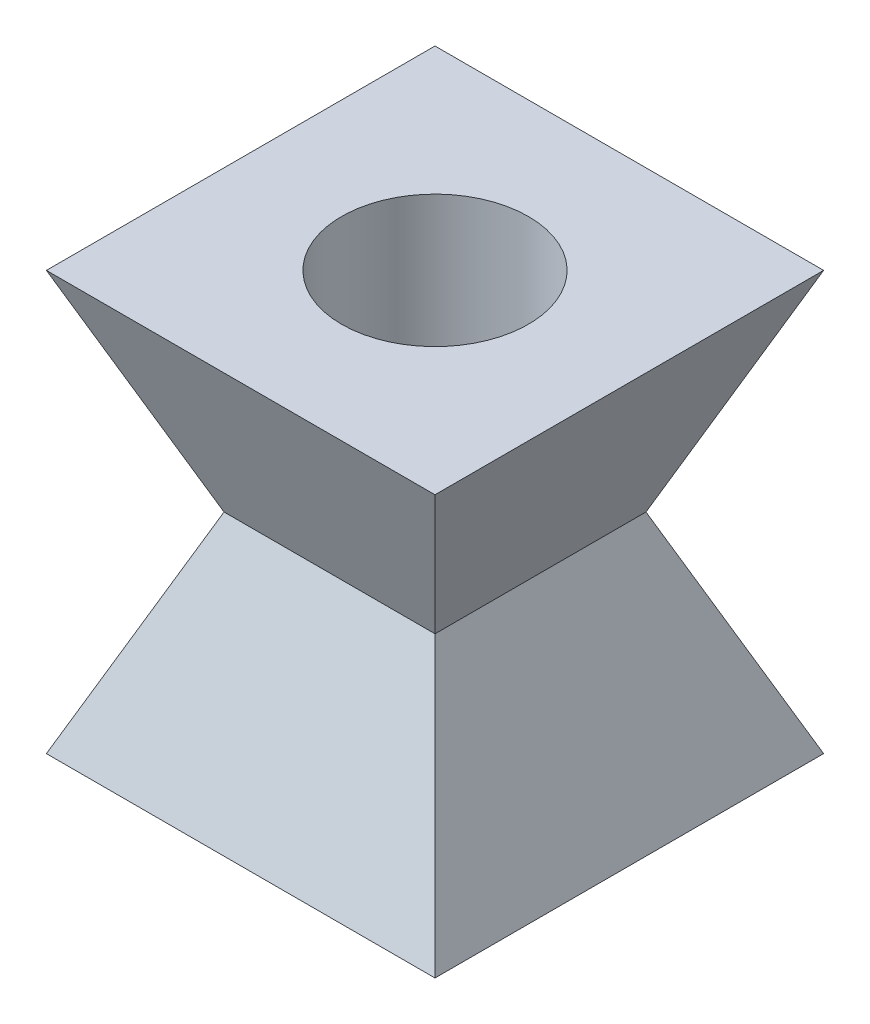
ISO-10303-21;
HEADER;
FILE_DESCRIPTION(('STEP AP214'),'2;1');
FILE_NAME('part.step','',(''),(''),'','','');
FILE_SCHEMA(('AUTOMOTIVE_DESIGN { 1 0 10303 214 1 1 1 1 }'));
ENDSEC;
DATA;
#1=APPLICATION_CONTEXT('core data for automotive mechanical design processes');
#2=APPLICATION_PROTOCOL_DEFINITION('international standard','automotive_design',2000,#1);
#3=PRODUCT_CONTEXT('',#1,'mechanical');
#4=PRODUCT('Part','Part','',(#3));
#5=PRODUCT_RELATED_PRODUCT_CATEGORY('part','',(#4));
#6=PRODUCT_DEFINITION_FORMATION('','',#4);
#7=PRODUCT_DEFINITION_CONTEXT('part definition',#1,'design');
#8=PRODUCT_DEFINITION('design','',#6,#7);
#9=PRODUCT_DEFINITION_SHAPE('','',#8);
#10=(LENGTH_UNIT() NAMED_UNIT(*) SI_UNIT(.MILLI.,.METRE.));
#11=(NAMED_UNIT(*) PLANE_ANGLE_UNIT() SI_UNIT($,.RADIAN.));
#12=(NAMED_UNIT(*) SI_UNIT($,.STERADIAN.) SOLID_ANGLE_UNIT());
#13=UNCERTAINTY_MEASURE_WITH_UNIT(LENGTH_MEASURE(1.E-05),#10,'distance_accuracy_value','');
#14=(GEOMETRIC_REPRESENTATION_CONTEXT(3) GLOBAL_UNCERTAINTY_ASSIGNED_CONTEXT((#13)) GLOBAL_UNIT_ASSIGNED_CONTEXT((#10,
#11,#12)) REPRESENTATION_CONTEXT('',''));
#15=CARTESIAN_POINT('',(0.,0.,0.));
#16=DIRECTION('',(0.,0.,1.));
#17=DIRECTION('',(1.,0.,0.));
#18=AXIS2_PLACEMENT_3D('',#15,#16,#17);
#19=CARTESIAN_POINT('',(23.9196032224521,10.1532691816569,52.));
#20=DIRECTION('',(0.920504853452442,0.390731128489268,0.));
#21=DIRECTION('',(-0.390731128489269,0.920504853452443,0.));
#22=AXIS2_PLACEMENT_3D('',#19,#20,#21);
#23=PLANE('',#22);
#24=DIRECTION('',(0.,0.,-1.));
#25=VECTOR('',#24,1.);
#26=CARTESIAN_POINT('',(28.2294102922625,0.,52.));
#27=LINE('',#26,#25);
#28=CARTESIAN_POINT('',(28.2294102922625,0.,28.2294102922621));
#29=VERTEX_POINT('',#28);
#30=CARTESIAN_POINT('',(28.2294102922625,0.,-28.2294102922621));
#31=VERTEX_POINT('',#30);
#32=EDGE_CURVE('E11',#29,#31,#27,.T.);
#33=ORIENTED_EDGE('',*,*,#32,.F.);
#34=DIRECTION('',(0.363936289648097,-0.857380168976603,0.363936289648104));
#35=VECTOR('',#34,1.);
#36=CARTESIAN_POINT('',(27.6388411871618,1.39129362343403,27.6388411871613));
#37=LINE('',#36,#35);
#38=CARTESIAN_POINT('',(52.,-56.,52.));
#39=VERTEX_POINT('',#38);
#40=EDGE_CURVE('E96',#29,#39,#37,.T.);
#41=ORIENTED_EDGE('',*,*,#40,.T.);
#42=DIRECTION('',(0.,0.,-1.));
#43=VECTOR('',#42,1.);
#44=CARTESIAN_POINT('',(52.,-56.,52.));
#45=LINE('',#44,#43);
#46=CARTESIAN_POINT('',(52.,-56.,-52.));
#47=VERTEX_POINT('',#46);
#48=EDGE_CURVE('E102',#39,#47,#45,.T.);
#49=ORIENTED_EDGE('',*,*,#48,.T.);
#50=DIRECTION('',(0.363936289648097,-0.857380168976602,-0.363936289648104));
#51=VECTOR('',#50,1.);
#52=CARTESIAN_POINT('',(13.8640804031878,33.8425964050158,-13.8640804031871));
#53=LINE('',#52,#51);
#54=EDGE_CURVE('E155',#31,#47,#53,.T.);
#55=ORIENTED_EDGE('',*,*,#54,.F.);
#56=EDGE_LOOP('',(#33,#41,#49,#55));
#57=FACE_BOUND('',#56,.T.);
#58=ADVANCED_FACE('F45',(#57),#23,.T.);
#59=CARTESIAN_POINT('',(23.9196032224521,-10.1532691816569,52.));
#60=DIRECTION('',(-0.920504853452442,0.390731128489268,0.));
#61=DIRECTION('',(-0.390731128489269,-0.920504853452443,0.));
#62=AXIS2_PLACEMENT_3D('',#59,#60,#61);
#63=PLANE('',#62);
#64=DIRECTION('',(0.363936289648097,0.857380168976603,0.363936289648104));
#65=VECTOR('',#64,1.);
#66=CARTESIAN_POINT('',(27.6388411871618,-1.39129362343403,27.6388411871613));
#67=LINE('',#66,#65);
#68=CARTESIAN_POINT('',(52.,56.,52.));
#69=VERTEX_POINT('',#68);
#70=EDGE_CURVE('E143',#29,#69,#67,.T.);
#71=ORIENTED_EDGE('',*,*,#70,.F.);
#72=ORIENTED_EDGE('',*,*,#32,.T.);
#73=DIRECTION('',(0.363936289648097,0.857380168976602,-0.363936289648104));
#74=VECTOR('',#73,1.);
#75=CARTESIAN_POINT('',(13.8640804031878,-33.8425964050158,-13.8640804031871));
#76=LINE('',#75,#74);
#77=CARTESIAN_POINT('',(52.,56.,-52.));
#78=VERTEX_POINT('',#77);
#79=EDGE_CURVE('E144',#31,#78,#76,.T.);
#80=ORIENTED_EDGE('',*,*,#79,.T.);
#81=DIRECTION('',(0.,0.,-1.));
#82=VECTOR('',#81,1.);
#83=CARTESIAN_POINT('',(52.,56.,52.));
#84=LINE('',#83,#82);
#85=EDGE_CURVE('E54',#69,#78,#84,.T.);
#86=ORIENTED_EDGE('',*,*,#85,.F.);
#87=EDGE_LOOP('',(#71,#72,#80,#86));
#88=FACE_BOUND('',#87,.T.);
#89=ADVANCED_FACE('F142',(#88),#63,.F.);
#90=CARTESIAN_POINT('',(-23.9196032224521,-10.1532691816569,52.));
#91=DIRECTION('',(-0.920504853452442,-0.390731128489268,0.));
#92=DIRECTION('',(0.390731128489269,-0.920504853452443,0.));
#93=AXIS2_PLACEMENT_3D('',#90,#91,#92);
#94=PLANE('',#93);
#95=DIRECTION('',(0.,0.,-1.));
#96=VECTOR('',#95,1.);
#97=CARTESIAN_POINT('',(-28.2294102922625,0.,52.));
#98=LINE('',#97,#96);
#99=CARTESIAN_POINT('',(-28.2294102922625,0.,28.2294102922621));
#100=VERTEX_POINT('',#99);
#101=CARTESIAN_POINT('',(-28.2294102922625,0.,-28.229410292262));
#102=VERTEX_POINT('',#101);
#103=EDGE_CURVE('E119',#100,#102,#98,.T.);
#104=ORIENTED_EDGE('',*,*,#103,.F.);
#105=DIRECTION('',(-0.363936289648097,0.857380168976603,0.363936289648104));
#106=VECTOR('',#105,1.);
#107=CARTESIAN_POINT('',(-27.6388411871618,-1.39129362343403,27.6388411871613));
#108=LINE('',#107,#106);
#109=CARTESIAN_POINT('',(-52.,56.,52.));
#110=VERTEX_POINT('',#109);
#111=EDGE_CURVE('E111',#100,#110,#108,.T.);
#112=ORIENTED_EDGE('',*,*,#111,.T.);
#113=DIRECTION('',(0.,0.,-1.));
#114=VECTOR('',#113,1.);
#115=CARTESIAN_POINT('',(-52.,56.,52.));
#116=LINE('',#115,#114);
#117=CARTESIAN_POINT('',(-52.,56.,-52.));
#118=VERTEX_POINT('',#117);
#119=EDGE_CURVE('E127',#110,#118,#116,.T.);
#120=ORIENTED_EDGE('',*,*,#119,.T.);
#121=DIRECTION('',(-0.363936289648097,0.857380168976602,-0.363936289648104));
#122=VECTOR('',#121,1.);
#123=CARTESIAN_POINT('',(-13.8640804031878,-33.8425964050158,-13.8640804031871));
#124=LINE('',#123,#122);
#125=EDGE_CURVE('E150',#102,#118,#124,.T.);
#126=ORIENTED_EDGE('',*,*,#125,.F.);
#127=EDGE_LOOP('',(#104,#112,#120,#126));
#128=FACE_BOUND('',#127,.T.);
#129=ADVANCED_FACE('F188',(#128),#94,.T.);
#130=CARTESIAN_POINT('',(-23.9196032224521,10.1532691816569,52.));
#131=DIRECTION('',(0.920504853452442,-0.390731128489268,0.));
#132=DIRECTION('',(0.390731128489269,0.920504853452443,0.));
#133=AXIS2_PLACEMENT_3D('',#130,#131,#132);
#134=PLANE('',#133);
#135=DIRECTION('',(-0.363936289648097,-0.857380168976603,0.363936289648104));
#136=VECTOR('',#135,1.);
#137=CARTESIAN_POINT('',(-27.6388411871618,1.39129362343403,27.6388411871613));
#138=LINE('',#137,#136);
#139=CARTESIAN_POINT('',(-52.,-56.,52.));
#140=VERTEX_POINT('',#139);
#141=EDGE_CURVE('E60',#100,#140,#138,.T.);
#142=ORIENTED_EDGE('',*,*,#141,.F.);
#143=ORIENTED_EDGE('',*,*,#103,.T.);
#144=DIRECTION('',(-0.363936289648097,-0.857380168976602,-0.363936289648104));
#145=VECTOR('',#144,1.);
#146=CARTESIAN_POINT('',(-13.8640804031878,33.8425964050158,-13.8640804031871));
#147=LINE('',#146,#145);
#148=CARTESIAN_POINT('',(-52.,-56.,-52.));
#149=VERTEX_POINT('',#148);
#150=EDGE_CURVE('E149',#102,#149,#147,.T.);
#151=ORIENTED_EDGE('',*,*,#150,.T.);
#152=DIRECTION('',(0.,0.,-1.));
#153=VECTOR('',#152,1.);
#154=CARTESIAN_POINT('',(-52.,-56.,52.));
#155=LINE('',#154,#153);
#156=EDGE_CURVE('E116',#140,#149,#155,.T.);
#157=ORIENTED_EDGE('',*,*,#156,.F.);
#158=EDGE_LOOP('',(#142,#143,#151,#157));
#159=FACE_BOUND('',#158,.T.);
#160=ADVANCED_FACE('F184',(#159),#134,.F.);
#161=CARTESIAN_POINT('',(0.,56.,52.));
#162=DIRECTION('',(0.,-1.,0.));
#163=DIRECTION('',(0.,0.,-1.));
#164=AXIS2_PLACEMENT_3D('',#161,#162,#163);
#165=PLANE('',#164);
#166=CARTESIAN_POINT('',(0.,56.,0.));
#167=DIRECTION('',(0.,1.,0.));
#168=DIRECTION('',(0.,0.,1.));
#169=AXIS2_PLACEMENT_3D('',#166,#167,#168);
#170=CIRCLE('',#169,25.);
#171=CARTESIAN_POINT('',(0.,56.,25.));
#172=VERTEX_POINT('',#171);
#173=EDGE_CURVE('E170',#172,#172,#170,.T.);
#174=ORIENTED_EDGE('',*,*,#173,.F.);
#175=EDGE_LOOP('',(#174));
#176=FACE_BOUND('',#175,.T.);
#177=DIRECTION('',(-1.,0.,0.));
#178=VECTOR('',#177,1.);
#179=CARTESIAN_POINT('',(0.,56.,-52.));
#180=LINE('',#179,#178);
#181=EDGE_CURVE('E138',#78,#118,#180,.T.);
#182=ORIENTED_EDGE('',*,*,#181,.T.);
#183=ORIENTED_EDGE('',*,*,#119,.F.);
#184=DIRECTION('',(-1.,0.,0.));
#185=VECTOR('',#184,1.);
#186=CARTESIAN_POINT('',(0.,56.,52.));
#187=LINE('',#186,#185);
#188=EDGE_CURVE('E103',#69,#110,#187,.T.);
#189=ORIENTED_EDGE('',*,*,#188,.F.);
#190=ORIENTED_EDGE('',*,*,#85,.T.);
#191=EDGE_LOOP('',(#182,#183,#189,#190));
#192=FACE_BOUND('',#191,.T.);
#193=ADVANCED_FACE('F136',(#176,#192),#165,.F.);
#194=CARTESIAN_POINT('',(0.,-56.,52.));
#195=DIRECTION('',(0.,-1.,0.));
#196=DIRECTION('',(0.,0.,-1.));
#197=AXIS2_PLACEMENT_3D('',#194,#195,#196);
#198=PLANE('',#197);
#199=CARTESIAN_POINT('',(0.,-56.,0.));
#200=DIRECTION('',(0.,1.,0.));
#201=DIRECTION('',(0.,0.,1.));
#202=AXIS2_PLACEMENT_3D('',#199,#200,#201);
#203=CIRCLE('',#202,25.);
#204=CARTESIAN_POINT('',(0.,-56.,25.));
#205=VERTEX_POINT('',#204);
#206=EDGE_CURVE('E171',#205,#205,#203,.T.);
#207=ORIENTED_EDGE('',*,*,#206,.T.);
#208=EDGE_LOOP('',(#207));
#209=FACE_BOUND('',#208,.T.);
#210=DIRECTION('',(-1.,0.,0.));
#211=VECTOR('',#210,1.);
#212=CARTESIAN_POINT('',(0.,-56.,-52.));
#213=LINE('',#212,#211);
#214=EDGE_CURVE('E114',#47,#149,#213,.T.);
#215=ORIENTED_EDGE('',*,*,#214,.F.);
#216=ORIENTED_EDGE('',*,*,#48,.F.);
#217=DIRECTION('',(-1.,0.,0.));
#218=VECTOR('',#217,1.);
#219=CARTESIAN_POINT('',(0.,-56.,52.));
#220=LINE('',#219,#218);
#221=EDGE_CURVE('E93',#39,#140,#220,.T.);
#222=ORIENTED_EDGE('',*,*,#221,.T.);
#223=ORIENTED_EDGE('',*,*,#156,.T.);
#224=EDGE_LOOP('',(#215,#216,#222,#223));
#225=FACE_BOUND('',#224,.T.);
#226=ADVANCED_FACE('F113',(#209,#225),#198,.T.);
#227=CARTESIAN_POINT('',(0.,-56.,0.));
#228=DIRECTION('',(0.,1.,0.));
#229=DIRECTION('',(0.,0.,1.));
#230=AXIS2_PLACEMENT_3D('',#227,#228,#229);
#231=CYLINDRICAL_SURFACE('',#230,25.);
#232=CARTESIAN_POINT('',(0.,-56.,25.));
#233=CARTESIAN_POINT('',(0.,-54.8333333333333,25.));
#234=CARTESIAN_POINT('',(0.,-53.6666666666667,25.));
#235=CARTESIAN_POINT('',(0.,-51.3333333333333,25.));
#236=CARTESIAN_POINT('',(0.,-50.1666666666667,25.));
#237=CARTESIAN_POINT('',(0.,-47.8333333333333,25.));
#238=CARTESIAN_POINT('',(0.,-46.6666666666667,25.));
#239=CARTESIAN_POINT('',(0.,-44.3333333333333,25.));
#240=CARTESIAN_POINT('',(0.,-43.1666666666667,25.));
#241=CARTESIAN_POINT('',(0.,-40.8333333333333,25.));
#242=CARTESIAN_POINT('',(0.,-39.6666666666667,25.));
#243=CARTESIAN_POINT('',(0.,-37.3333333333333,25.));
#244=CARTESIAN_POINT('',(0.,-36.1666666666667,25.));
#245=CARTESIAN_POINT('',(0.,-33.8333333333333,25.));
#246=CARTESIAN_POINT('',(0.,-32.6666666666667,25.));
#247=CARTESIAN_POINT('',(0.,-30.3333333333333,25.));
#248=CARTESIAN_POINT('',(0.,-29.1666666666667,25.));
#249=CARTESIAN_POINT('',(0.,-26.8333333333333,25.));
#250=CARTESIAN_POINT('',(0.,-25.6666666666667,25.));
#251=CARTESIAN_POINT('',(0.,-23.3333333333333,25.));
#252=CARTESIAN_POINT('',(0.,-22.1666666666667,25.));
#253=CARTESIAN_POINT('',(0.,-19.8333333333333,25.));
#254=CARTESIAN_POINT('',(0.,-18.6666666666667,25.));
#255=CARTESIAN_POINT('',(0.,-16.3333333333333,25.));
#256=CARTESIAN_POINT('',(0.,-15.1666666666667,25.));
#257=CARTESIAN_POINT('',(0.,-12.8333333333333,25.));
#258=CARTESIAN_POINT('',(0.,-11.6666666666667,25.));
#259=CARTESIAN_POINT('',(0.,-9.33333333333334,25.));
#260=CARTESIAN_POINT('',(0.,-8.16666666666667,25.));
#261=CARTESIAN_POINT('',(0.,-5.83333333333334,25.));
#262=CARTESIAN_POINT('',(0.,-4.66666666666668,25.));
#263=CARTESIAN_POINT('',(0.,-2.33333333333334,25.));
#264=CARTESIAN_POINT('',(0.,-1.16666666666667,25.));
#265=CARTESIAN_POINT('',(0.,1.16666666666666,25.));
#266=CARTESIAN_POINT('',(0.,2.33333333333333,25.));
#267=CARTESIAN_POINT('',(0.,4.66666666666666,25.));
#268=CARTESIAN_POINT('',(0.,5.83333333333333,25.));
#269=CARTESIAN_POINT('',(0.,8.16666666666666,25.));
#270=CARTESIAN_POINT('',(0.,9.33333333333332,25.));
#271=CARTESIAN_POINT('',(0.,11.6666666666666,25.));
#272=CARTESIAN_POINT('',(0.,12.8333333333333,25.));
#273=CARTESIAN_POINT('',(0.,15.1666666666667,25.));
#274=CARTESIAN_POINT('',(0.,16.3333333333333,25.));
#275=CARTESIAN_POINT('',(0.,18.6666666666667,25.));
#276=CARTESIAN_POINT('',(0.,19.8333333333333,25.));
#277=CARTESIAN_POINT('',(0.,22.1666666666666,25.));
#278=CARTESIAN_POINT('',(0.,23.3333333333333,25.));
#279=CARTESIAN_POINT('',(0.,25.6666666666666,25.));
#280=CARTESIAN_POINT('',(0.,26.8333333333333,25.));
#281=CARTESIAN_POINT('',(0.,29.1666666666667,25.));
#282=CARTESIAN_POINT('',(0.,30.3333333333333,25.));
#283=CARTESIAN_POINT('',(0.,32.6666666666667,25.));
#284=CARTESIAN_POINT('',(0.,33.8333333333333,25.));
#285=CARTESIAN_POINT('',(0.,36.1666666666667,25.));
#286=CARTESIAN_POINT('',(0.,37.3333333333333,25.));
#287=CARTESIAN_POINT('',(0.,39.6666666666667,25.));
#288=CARTESIAN_POINT('',(0.,40.8333333333333,25.));
#289=CARTESIAN_POINT('',(0.,43.1666666666667,25.));
#290=CARTESIAN_POINT('',(0.,44.3333333333333,25.));
#291=CARTESIAN_POINT('',(0.,46.6666666666667,25.));
#292=CARTESIAN_POINT('',(0.,47.8333333333333,25.));
#293=CARTESIAN_POINT('',(0.,50.1666666666666,25.));
#294=CARTESIAN_POINT('',(0.,51.3333333333333,25.));
#295=CARTESIAN_POINT('',(0.,53.6666666666667,25.));
#296=CARTESIAN_POINT('',(0.,54.8333333333333,25.));
#297=CARTESIAN_POINT('',(0.,56.,25.));
#298=B_SPLINE_CURVE_WITH_KNOTS('',3,(#232,#233,#234,#235,#236,#237,#238,#239,#240,#241,#242,
#243,#244,#245,#246,#247,#248,#249,#250,#251,#252,#253,#254,#255,#256,#257,#258,#259,#260,#261,
#262,#263,#264,#265,#266,#267,#268,#269,#270,#271,#272,#273,#274,#275,#276,#277,#278,#279,#280,
#281,#282,#283,#284,#285,#286,#287,#288,#289,#290,#291,#292,#293,#294,#295,#296,#297),
.UNSPECIFIED.,.F.,.F.,(4,2,2,2,2,2,2,2,2,2,2,2,2,2,2,2,2,2,2,2,2,2,2,2,2,2,2,2,2,2,2,2,4),(0.,
3.5,6.99999999999999,10.5,14.,17.5,21.,24.5,28.,31.5,35.,38.5,42.,45.5,49.,52.5,56.,59.5,63.,
66.5,70.,73.5,77.,80.5,84.,87.5,91.,94.5,98.,101.5,105.,108.5,112.),.UNSPECIFIED.);
#299=EDGE_CURVE('BSEAM220',#205,#172,#298,.T.);
#300=ORIENTED_EDGE('',*,*,#206,.F.);
#301=ORIENTED_EDGE('',*,*,#173,.T.);
#302=ORIENTED_EDGE('',*,*,#299,.T.);
#303=ORIENTED_EDGE('',*,*,#299,.F.);
#304=EDGE_LOOP('',(#300,#302,#301,#303));
#305=FACE_BOUND('',#304,.T.);
#306=ADVANCED_FACE('F220',(#305),#231,.F.);
#307=CARTESIAN_POINT('',(-52.,0.,-28.2294102922621));
#308=DIRECTION('',(0.,-0.390731128489275,0.92050485345244));
#309=DIRECTION('',(0.,-0.92050485345244,-0.390731128489275));
#310=AXIS2_PLACEMENT_3D('',#307,#308,#309);
#311=PLANE('',#310);
#312=ORIENTED_EDGE('',*,*,#54,.T.);
#313=ORIENTED_EDGE('',*,*,#214,.T.);
#314=ORIENTED_EDGE('',*,*,#150,.F.);
#315=DIRECTION('',(1.,0.,0.));
#316=VECTOR('',#315,1.);
#317=CARTESIAN_POINT('',(-52.,0.,-28.2294102922621));
#318=LINE('',#317,#316);
#319=EDGE_CURVE('E190',#102,#31,#318,.T.);
#320=ORIENTED_EDGE('',*,*,#319,.T.);
#321=EDGE_LOOP('',(#312,#313,#314,#320));
#322=FACE_BOUND('',#321,.T.);
#323=ADVANCED_FACE('F182',(#322),#311,.F.);
#324=CARTESIAN_POINT('',(-52.,56.,-52.));
#325=DIRECTION('',(0.,0.390731128489275,0.92050485345244));
#326=DIRECTION('',(0.,-0.92050485345244,0.390731128489275));
#327=AXIS2_PLACEMENT_3D('',#324,#325,#326);
#328=PLANE('',#327);
#329=ORIENTED_EDGE('',*,*,#319,.F.);
#330=ORIENTED_EDGE('',*,*,#125,.T.);
#331=ORIENTED_EDGE('',*,*,#181,.F.);
#332=ORIENTED_EDGE('',*,*,#79,.F.);
#333=EDGE_LOOP('',(#329,#330,#331,#332));
#334=FACE_BOUND('',#333,.T.);
#335=ADVANCED_FACE('F189',(#334),#328,.F.);
#336=CARTESIAN_POINT('',(-52.,-10.1532691816569,23.9196032224516));
#337=DIRECTION('',(0.,-0.390731128489275,0.92050485345244));
#338=DIRECTION('',(0.,-0.92050485345244,-0.390731128489275));
#339=AXIS2_PLACEMENT_3D('',#336,#337,#338);
#340=PLANE('',#339);
#341=ORIENTED_EDGE('',*,*,#70,.T.);
#342=ORIENTED_EDGE('',*,*,#188,.T.);
#343=ORIENTED_EDGE('',*,*,#111,.F.);
#344=DIRECTION('',(1.,0.,0.));
#345=VECTOR('',#344,1.);
#346=CARTESIAN_POINT('',(-52.,0.,28.2294102922621));
#347=LINE('',#346,#345);
#348=EDGE_CURVE('E157',#100,#29,#347,.T.);
#349=ORIENTED_EDGE('',*,*,#348,.T.);
#350=EDGE_LOOP('',(#341,#342,#343,#349));
#351=FACE_BOUND('',#350,.T.);
#352=ADVANCED_FACE('F195',(#351),#340,.T.);
#353=CARTESIAN_POINT('',(-52.,10.1532691816568,23.9196032224516));
#354=DIRECTION('',(0.,0.390731128489275,0.92050485345244));
#355=DIRECTION('',(0.,-0.92050485345244,0.390731128489275));
#356=AXIS2_PLACEMENT_3D('',#353,#354,#355);
#357=PLANE('',#356);
#358=ORIENTED_EDGE('',*,*,#348,.F.);
#359=ORIENTED_EDGE('',*,*,#141,.T.);
#360=ORIENTED_EDGE('',*,*,#221,.F.);
#361=ORIENTED_EDGE('',*,*,#40,.F.);
#362=EDGE_LOOP('',(#358,#359,#360,#361));
#363=FACE_BOUND('',#362,.T.);
#364=ADVANCED_FACE('F95',(#363),#357,.T.);
#365=CLOSED_SHELL('',(#58,#89,#129,#160,#193,#226,#306,#323,#335,#352,#364));
#366=MANIFOLD_SOLID_BREP('B2',#365);
#367=ADVANCED_BREP_SHAPE_REPRESENTATION('',(#18,#366),#14);
#368=SHAPE_DEFINITION_REPRESENTATION(#9,#367);
ENDSEC;
END-ISO-10303-21;
